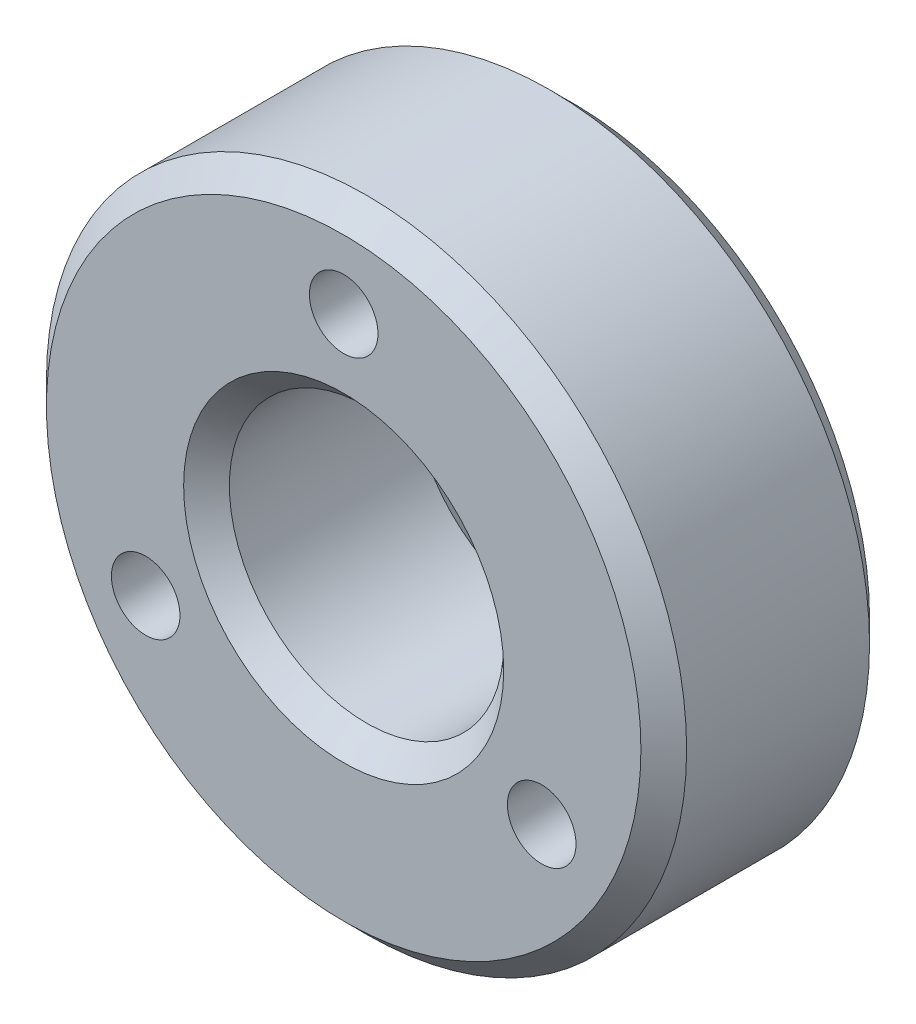
ISO-10303-21;
HEADER;
FILE_DESCRIPTION(('STEP AP214'),'2;1');
FILE_NAME('part.step','',(''),(''),'','','');
FILE_SCHEMA(('AUTOMOTIVE_DESIGN { 1 0 10303 214 1 1 1 1 }'));
ENDSEC;
DATA;
#1=APPLICATION_CONTEXT('core data for automotive mechanical design processes');
#2=APPLICATION_PROTOCOL_DEFINITION('international standard','automotive_design',2000,#1);
#3=PRODUCT_CONTEXT('',#1,'mechanical');
#4=PRODUCT('Part','Part','',(#3));
#5=PRODUCT_RELATED_PRODUCT_CATEGORY('part','',(#4));
#6=PRODUCT_DEFINITION_FORMATION('','',#4);
#7=PRODUCT_DEFINITION_CONTEXT('part definition',#1,'design');
#8=PRODUCT_DEFINITION('design','',#6,#7);
#9=PRODUCT_DEFINITION_SHAPE('','',#8);
#10=(LENGTH_UNIT() NAMED_UNIT(*) SI_UNIT(.MILLI.,.METRE.));
#11=(NAMED_UNIT(*) PLANE_ANGLE_UNIT() SI_UNIT($,.RADIAN.));
#12=(NAMED_UNIT(*) SI_UNIT($,.STERADIAN.) SOLID_ANGLE_UNIT());
#13=UNCERTAINTY_MEASURE_WITH_UNIT(LENGTH_MEASURE(1.E-05),#10,'distance_accuracy_value','');
#14=(GEOMETRIC_REPRESENTATION_CONTEXT(3) GLOBAL_UNCERTAINTY_ASSIGNED_CONTEXT((#13)) GLOBAL_UNIT_ASSIGNED_CONTEXT((#10,
#11,#12)) REPRESENTATION_CONTEXT('',''));
#15=CARTESIAN_POINT('',(0.,0.,0.));
#16=DIRECTION('',(0.,0.,1.));
#17=DIRECTION('',(1.,0.,0.));
#18=AXIS2_PLACEMENT_3D('',#15,#16,#17);
#19=CARTESIAN_POINT('',(0.,0.,10.));
#20=DIRECTION('',(0.,0.,1.));
#21=DIRECTION('',(1.,0.,0.));
#22=AXIS2_PLACEMENT_3D('',#19,#20,#21);
#23=PLANE('',#22);
#24=CARTESIAN_POINT('',(0.,0.,10.));
#25=DIRECTION('',(0.,0.,1.));
#26=DIRECTION('',(1.,0.,0.));
#27=AXIS2_PLACEMENT_3D('',#24,#25,#26);
#28=CIRCLE('',#27,13.);
#29=CARTESIAN_POINT('',(13.,0.,10.));
#30=VERTEX_POINT('',#29);
#31=EDGE_CURVE('E62',#30,#30,#28,.T.);
#32=ORIENTED_EDGE('',*,*,#31,.T.);
#33=EDGE_LOOP('',(#32));
#34=FACE_BOUND('',#33,.T.);
#35=CARTESIAN_POINT('',(0.,0.,10.));
#36=DIRECTION('',(0.,0.,1.));
#37=DIRECTION('',(1.,0.,0.));
#38=AXIS2_PLACEMENT_3D('',#35,#36,#37);
#39=CIRCLE('',#38,7.00000000000001);
#40=CARTESIAN_POINT('',(7.00000000000001,0.,10.));
#41=VERTEX_POINT('',#40);
#42=EDGE_CURVE('E65',#41,#41,#39,.F.);
#43=ORIENTED_EDGE('',*,*,#42,.T.);
#44=EDGE_LOOP('',(#43));
#45=FACE_BOUND('',#44,.T.);
#46=CARTESIAN_POINT('',(8.66025403784481,-4.99999999999975,10.));
#47=DIRECTION('',(0.,0.,1.));
#48=DIRECTION('',(1.,0.,0.));
#49=AXIS2_PLACEMENT_3D('',#46,#47,#48);
#50=CIRCLE('',#49,1.50000000000038);
#51=CARTESIAN_POINT('',(10.1602540378452,-4.99999999999975,10.));
#52=VERTEX_POINT('',#51);
#53=EDGE_CURVE('E72',#52,#52,#50,.T.);
#54=ORIENTED_EDGE('',*,*,#53,.F.);
#55=EDGE_LOOP('',(#54));
#56=FACE_BOUND('',#55,.T.);
#57=CARTESIAN_POINT('',(0.,10.,10.));
#58=DIRECTION('',(0.,0.,1.));
#59=DIRECTION('',(1.,0.,0.));
#60=AXIS2_PLACEMENT_3D('',#57,#58,#59);
#61=CIRCLE('',#60,1.5);
#62=CARTESIAN_POINT('',(1.5,10.,10.));
#63=VERTEX_POINT('',#62);
#64=EDGE_CURVE('E68',#63,#63,#61,.T.);
#65=ORIENTED_EDGE('',*,*,#64,.F.);
#66=EDGE_LOOP('',(#65));
#67=FACE_BOUND('',#66,.T.);
#68=CARTESIAN_POINT('',(-8.66025403784396,-5.00000000000025,10.));
#69=DIRECTION('',(0.,0.,1.));
#70=DIRECTION('',(1.,0.,0.));
#71=AXIS2_PLACEMENT_3D('',#68,#69,#70);
#72=CIRCLE('',#71,1.50000000000057);
#73=CARTESIAN_POINT('',(-7.16025403784339,-5.00000000000025,10.));
#74=VERTEX_POINT('',#73);
#75=EDGE_CURVE('E78',#74,#74,#72,.T.);
#76=ORIENTED_EDGE('',*,*,#75,.F.);
#77=EDGE_LOOP('',(#76));
#78=FACE_BOUND('',#77,.T.);
#79=ADVANCED_FACE('F36',(#34,#45,#56,#67,#78),#23,.T.);
#80=CARTESIAN_POINT('',(0.,0.,0.));
#81=DIRECTION('',(0.,0.,1.));
#82=DIRECTION('',(1.,0.,0.));
#83=AXIS2_PLACEMENT_3D('',#80,#81,#82);
#84=PLANE('',#83);
#85=CARTESIAN_POINT('',(0.,0.,0.));
#86=DIRECTION('',(0.,0.,1.));
#87=DIRECTION('',(1.,0.,0.));
#88=AXIS2_PLACEMENT_3D('',#85,#86,#87);
#89=CIRCLE('',#88,13.);
#90=CARTESIAN_POINT('',(13.,0.,0.));
#91=VERTEX_POINT('',#90);
#92=EDGE_CURVE('E47',#91,#91,#89,.F.);
#93=ORIENTED_EDGE('',*,*,#92,.T.);
#94=EDGE_LOOP('',(#93));
#95=FACE_BOUND('',#94,.T.);
#96=CARTESIAN_POINT('',(0.,0.,0.));
#97=DIRECTION('',(0.,0.,1.));
#98=DIRECTION('',(1.,0.,0.));
#99=AXIS2_PLACEMENT_3D('',#96,#97,#98);
#100=CIRCLE('',#99,7.00000000000001);
#101=CARTESIAN_POINT('',(7.00000000000001,0.,0.));
#102=VERTEX_POINT('',#101);
#103=EDGE_CURVE('E51',#102,#102,#100,.T.);
#104=ORIENTED_EDGE('',*,*,#103,.T.);
#105=EDGE_LOOP('',(#104));
#106=FACE_BOUND('',#105,.T.);
#107=CARTESIAN_POINT('',(0.,10.,0.));
#108=DIRECTION('',(0.,0.,1.));
#109=DIRECTION('',(1.,0.,0.));
#110=AXIS2_PLACEMENT_3D('',#107,#108,#109);
#111=CIRCLE('',#110,1.5);
#112=CARTESIAN_POINT('',(1.5,10.,0.));
#113=VERTEX_POINT('',#112);
#114=EDGE_CURVE('E69',#113,#113,#111,.T.);
#115=ORIENTED_EDGE('',*,*,#114,.T.);
#116=EDGE_LOOP('',(#115));
#117=FACE_BOUND('',#116,.T.);
#118=CARTESIAN_POINT('',(8.66025403784481,-4.99999999999975,0.));
#119=DIRECTION('',(0.,0.,1.));
#120=DIRECTION('',(1.,0.,0.));
#121=AXIS2_PLACEMENT_3D('',#118,#119,#120);
#122=CIRCLE('',#121,1.50000000000038);
#123=CARTESIAN_POINT('',(10.1602540378452,-4.99999999999975,0.));
#124=VERTEX_POINT('',#123);
#125=EDGE_CURVE('E75',#124,#124,#122,.T.);
#126=ORIENTED_EDGE('',*,*,#125,.T.);
#127=EDGE_LOOP('',(#126));
#128=FACE_BOUND('',#127,.T.);
#129=CARTESIAN_POINT('',(-8.66025403784396,-5.00000000000025,0.));
#130=DIRECTION('',(0.,0.,1.));
#131=DIRECTION('',(1.,0.,0.));
#132=AXIS2_PLACEMENT_3D('',#129,#130,#131);
#133=CIRCLE('',#132,1.50000000000057);
#134=CARTESIAN_POINT('',(-7.16025403784339,-5.00000000000025,0.));
#135=VERTEX_POINT('',#134);
#136=EDGE_CURVE('E81',#135,#135,#133,.T.);
#137=ORIENTED_EDGE('',*,*,#136,.T.);
#138=EDGE_LOOP('',(#137));
#139=FACE_BOUND('',#138,.T.);
#140=ADVANCED_FACE('F91',(#95,#106,#117,#128,#139),#84,.F.);
#141=CARTESIAN_POINT('',(0.,0.,10.));
#142=DIRECTION('',(0.,0.,-1.));
#143=DIRECTION('',(-1.,0.,0.));
#144=AXIS2_PLACEMENT_3D('',#141,#142,#143);
#145=CYLINDRICAL_SURFACE('',#144,14.);
#146=CARTESIAN_POINT('',(0.,0.,9.00000000000001));
#147=DIRECTION('',(0.,0.,1.));
#148=DIRECTION('',(1.,0.,0.));
#149=AXIS2_PLACEMENT_3D('',#146,#147,#148);
#150=CIRCLE('',#149,14.);
#151=CARTESIAN_POINT('',(14.,0.,9.00000000000001));
#152=VERTEX_POINT('',#151);
#153=EDGE_CURVE('E56',#152,#152,#150,.F.);
#154=ORIENTED_EDGE('',*,*,#153,.T.);
#155=EDGE_LOOP('',(#154));
#156=FACE_BOUND('',#155,.T.);
#157=CARTESIAN_POINT('',(0.,0.,1.));
#158=DIRECTION('',(0.,0.,1.));
#159=DIRECTION('',(1.,0.,0.));
#160=AXIS2_PLACEMENT_3D('',#157,#158,#159);
#161=CIRCLE('',#160,14.);
#162=CARTESIAN_POINT('',(14.,0.,1.));
#163=VERTEX_POINT('',#162);
#164=EDGE_CURVE('E59',#163,#163,#161,.T.);
#165=ORIENTED_EDGE('',*,*,#164,.T.);
#166=EDGE_LOOP('',(#165));
#167=FACE_BOUND('',#166,.T.);
#168=ADVANCED_FACE('F97',(#156,#167),#145,.T.);
#169=CARTESIAN_POINT('',(0.,0.,10.));
#170=DIRECTION('',(0.,0.,-1.));
#171=DIRECTION('',(-1.,0.,0.));
#172=AXIS2_PLACEMENT_3D('',#169,#170,#171);
#173=CYLINDRICAL_SURFACE('',#172,6.);
#174=CARTESIAN_POINT('',(0.,0.,1.00000000000001));
#175=DIRECTION('',(0.,0.,1.));
#176=DIRECTION('',(1.,0.,0.));
#177=AXIS2_PLACEMENT_3D('',#174,#175,#176);
#178=CIRCLE('',#177,6.);
#179=CARTESIAN_POINT('',(6.,0.,1.00000000000001));
#180=VERTEX_POINT('',#179);
#181=EDGE_CURVE('E10',#180,#180,#178,.F.);
#182=ORIENTED_EDGE('',*,*,#181,.T.);
#183=EDGE_LOOP('',(#182));
#184=FACE_BOUND('',#183,.T.);
#185=CARTESIAN_POINT('',(0.,0.,8.99999999999999));
#186=DIRECTION('',(0.,0.,1.));
#187=DIRECTION('',(1.,0.,0.));
#188=AXIS2_PLACEMENT_3D('',#185,#186,#187);
#189=CIRCLE('',#188,6.);
#190=CARTESIAN_POINT('',(6.,0.,8.99999999999999));
#191=VERTEX_POINT('',#190);
#192=EDGE_CURVE('E43',#191,#191,#189,.T.);
#193=ORIENTED_EDGE('',*,*,#192,.T.);
#194=EDGE_LOOP('',(#193));
#195=FACE_BOUND('',#194,.T.);
#196=ADVANCED_FACE('F102',(#184,#195),#173,.F.);
#197=CARTESIAN_POINT('',(0.,10.,10.));
#198=DIRECTION('',(0.,0.,-1.));
#199=DIRECTION('',(-1.,0.,0.));
#200=AXIS2_PLACEMENT_3D('',#197,#198,#199);
#201=CYLINDRICAL_SURFACE('',#200,1.5);
#202=ORIENTED_EDGE('',*,*,#64,.T.);
#203=EDGE_LOOP('',(#202));
#204=FACE_BOUND('',#203,.T.);
#205=ORIENTED_EDGE('',*,*,#114,.F.);
#206=EDGE_LOOP('',(#205));
#207=FACE_BOUND('',#206,.T.);
#208=ADVANCED_FACE('F137',(#204,#207),#201,.F.);
#209=CARTESIAN_POINT('',(8.66025403784481,-4.99999999999975,10.));
#210=DIRECTION('',(0.,0.,-1.));
#211=DIRECTION('',(-1.,0.,0.));
#212=AXIS2_PLACEMENT_3D('',#209,#210,#211);
#213=CYLINDRICAL_SURFACE('',#212,1.50000000000038);
#214=ORIENTED_EDGE('',*,*,#53,.T.);
#215=EDGE_LOOP('',(#214));
#216=FACE_BOUND('',#215,.T.);
#217=ORIENTED_EDGE('',*,*,#125,.F.);
#218=EDGE_LOOP('',(#217));
#219=FACE_BOUND('',#218,.T.);
#220=ADVANCED_FACE('F132',(#216,#219),#213,.F.);
#221=CARTESIAN_POINT('',(-8.66025403784396,-5.00000000000025,10.));
#222=DIRECTION('',(0.,0.,-1.));
#223=DIRECTION('',(-1.,0.,0.));
#224=AXIS2_PLACEMENT_3D('',#221,#222,#223);
#225=CYLINDRICAL_SURFACE('',#224,1.50000000000057);
#226=ORIENTED_EDGE('',*,*,#75,.T.);
#227=EDGE_LOOP('',(#226));
#228=FACE_BOUND('',#227,.T.);
#229=ORIENTED_EDGE('',*,*,#136,.F.);
#230=EDGE_LOOP('',(#229));
#231=FACE_BOUND('',#230,.T.);
#232=ADVANCED_FACE('F87',(#228,#231),#225,.F.);
#233=CARTESIAN_POINT('',(0.,0.,10.));
#234=DIRECTION('',(0.,0.,-1.));
#235=DIRECTION('',(-1.,0.,0.));
#236=AXIS2_PLACEMENT_3D('',#233,#234,#235);
#237=CONICAL_SURFACE('',#236,13.,0.785398163397447);
#238=ORIENTED_EDGE('',*,*,#153,.F.);
#239=EDGE_LOOP('',(#238));
#240=FACE_BOUND('',#239,.T.);
#241=ORIENTED_EDGE('',*,*,#31,.F.);
#242=EDGE_LOOP('',(#241));
#243=FACE_BOUND('',#242,.T.);
#244=ADVANCED_FACE('F108',(#240,#243),#237,.T.);
#245=CARTESIAN_POINT('',(0.,0.,1.));
#246=DIRECTION('',(0.,0.,1.));
#247=DIRECTION('',(1.,0.,0.));
#248=AXIS2_PLACEMENT_3D('',#245,#246,#247);
#249=CONICAL_SURFACE('',#248,14.,0.78539816339745);
#250=ORIENTED_EDGE('',*,*,#92,.F.);
#251=EDGE_LOOP('',(#250));
#252=FACE_BOUND('',#251,.T.);
#253=ORIENTED_EDGE('',*,*,#164,.F.);
#254=EDGE_LOOP('',(#253));
#255=FACE_BOUND('',#254,.T.);
#256=ADVANCED_FACE('F111',(#252,#255),#249,.T.);
#257=CARTESIAN_POINT('',(0.,0.,0.));
#258=DIRECTION('',(0.,0.,-1.));
#259=DIRECTION('',(-1.,0.,0.));
#260=AXIS2_PLACEMENT_3D('',#257,#258,#259);
#261=CONICAL_SURFACE('',#260,7.00000000000001,0.785398163397447);
#262=ORIENTED_EDGE('',*,*,#181,.F.);
#263=EDGE_LOOP('',(#262));
#264=FACE_BOUND('',#263,.T.);
#265=ORIENTED_EDGE('',*,*,#103,.F.);
#266=EDGE_LOOP('',(#265));
#267=FACE_BOUND('',#266,.T.);
#268=ADVANCED_FACE('F114',(#264,#267),#261,.F.);
#269=CARTESIAN_POINT('',(0.,0.,8.99999999999999));
#270=DIRECTION('',(0.,0.,1.));
#271=DIRECTION('',(1.,0.,0.));
#272=AXIS2_PLACEMENT_3D('',#269,#270,#271);
#273=CONICAL_SURFACE('',#272,6.,0.785398163397452);
#274=ORIENTED_EDGE('',*,*,#42,.F.);
#275=EDGE_LOOP('',(#274));
#276=FACE_BOUND('',#275,.T.);
#277=ORIENTED_EDGE('',*,*,#192,.F.);
#278=EDGE_LOOP('',(#277));
#279=FACE_BOUND('',#278,.T.);
#280=ADVANCED_FACE('F38',(#276,#279),#273,.F.);
#281=CLOSED_SHELL('',(#79,#140,#168,#196,#208,#220,#232,#244,#256,#268,#280));
#282=MANIFOLD_SOLID_BREP('B2',#281);
#283=ADVANCED_BREP_SHAPE_REPRESENTATION('',(#18,#282),#14);
#284=SHAPE_DEFINITION_REPRESENTATION(#9,#283);
ENDSEC;
END-ISO-10303-21;
